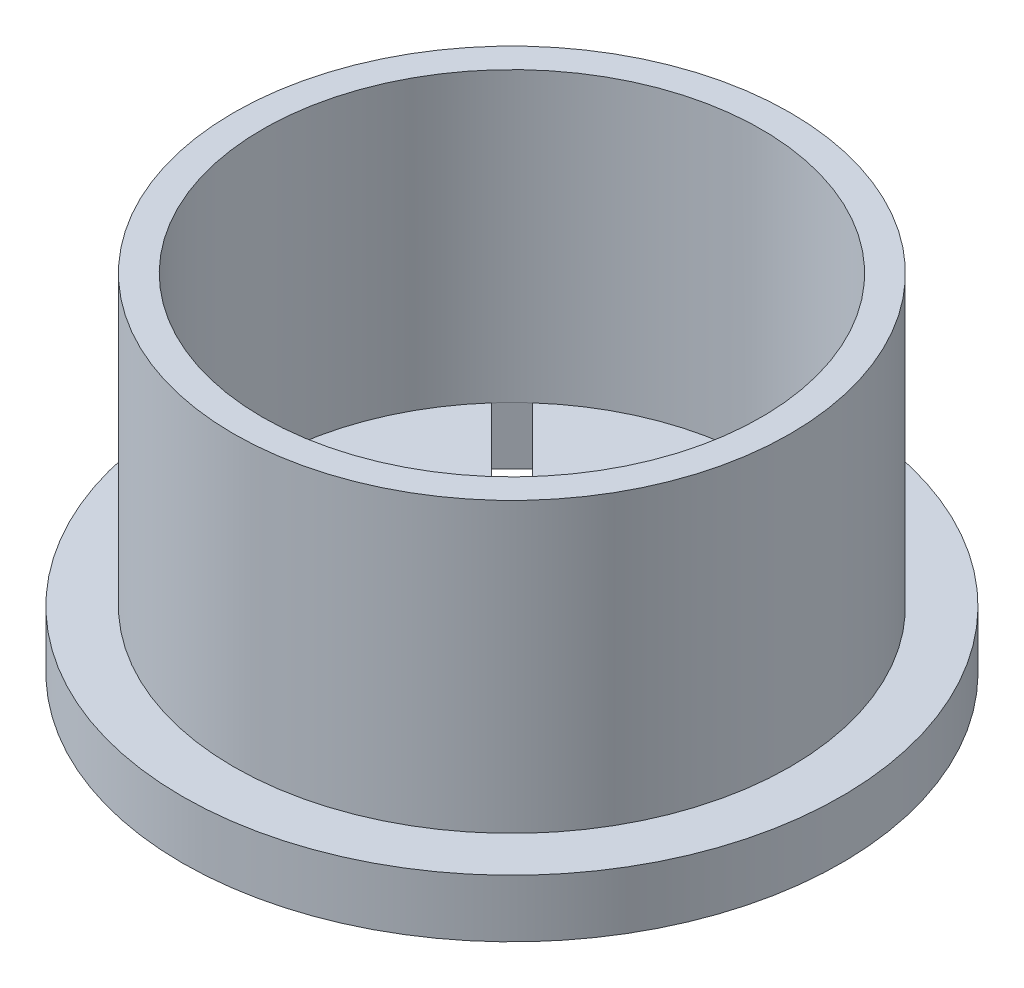
ISO-10303-21;
HEADER;
FILE_DESCRIPTION(('STEP AP214'),'2;1');
FILE_NAME('part.step','',(''),(''),'','','');
FILE_SCHEMA(('AUTOMOTIVE_DESIGN { 1 0 10303 214 1 1 1 1 }'));
ENDSEC;
DATA;
#1=APPLICATION_CONTEXT('core data for automotive mechanical design processes');
#2=APPLICATION_PROTOCOL_DEFINITION('international standard','automotive_design',2000,#1);
#3=PRODUCT_CONTEXT('',#1,'mechanical');
#4=PRODUCT('Part','Part','',(#3));
#5=PRODUCT_RELATED_PRODUCT_CATEGORY('part','',(#4));
#6=PRODUCT_DEFINITION_FORMATION('','',#4);
#7=PRODUCT_DEFINITION_CONTEXT('part definition',#1,'design');
#8=PRODUCT_DEFINITION('design','',#6,#7);
#9=PRODUCT_DEFINITION_SHAPE('','',#8);
#10=(LENGTH_UNIT() NAMED_UNIT(*) SI_UNIT(.MILLI.,.METRE.));
#11=(NAMED_UNIT(*) PLANE_ANGLE_UNIT() SI_UNIT($,.RADIAN.));
#12=(NAMED_UNIT(*) SI_UNIT($,.STERADIAN.) SOLID_ANGLE_UNIT());
#13=UNCERTAINTY_MEASURE_WITH_UNIT(LENGTH_MEASURE(1.E-05),#10,'distance_accuracy_value','');
#14=(GEOMETRIC_REPRESENTATION_CONTEXT(3) GLOBAL_UNCERTAINTY_ASSIGNED_CONTEXT((#13)) GLOBAL_UNIT_ASSIGNED_CONTEXT((#10,
#11,#12)) REPRESENTATION_CONTEXT('',''));
#15=CARTESIAN_POINT('',(0.,0.,0.));
#16=DIRECTION('',(0.,0.,1.));
#17=DIRECTION('',(1.,0.,0.));
#18=AXIS2_PLACEMENT_3D('',#15,#16,#17);
#19=CARTESIAN_POINT('',(0.,2.,0.));
#20=DIRECTION('',(0.,1.,0.));
#21=DIRECTION('',(0.,0.,1.));
#22=AXIS2_PLACEMENT_3D('',#19,#20,#21);
#23=PLANE('',#22);
#24=DIRECTION('',(0.707106781186549,0.,0.707106781186546));
#25=VECTOR('',#24,1.);
#26=CARTESIAN_POINT('',(-6.47002704785691,2.,-5.76292026667039));
#27=LINE('',#26,#25);
#28=CARTESIAN_POINT('',(5.75269341083889,2.,6.45980019202536));
#29=VERTEX_POINT('',#28);
#30=CARTESIAN_POINT('',(5.76292026667038,2.,6.47002704785686));
#31=VERTEX_POINT('',#30);
#32=EDGE_CURVE('E714',#29,#31,#27,.T.);
#33=ORIENTED_EDGE('',*,*,#32,.F.);
#34=CARTESIAN_POINT('',(0.,2.,0.));
#35=DIRECTION('',(0.,1.,0.));
#36=DIRECTION('',(0.,0.,1.));
#37=AXIS2_PLACEMENT_3D('',#34,#35,#36);
#38=CIRCLE('',#37,8.65);
#39=CARTESIAN_POINT('',(6.11647365726365,2.,6.11647365726362));
#40=VERTEX_POINT('',#39);
#41=EDGE_CURVE('E427',#29,#40,#38,.T.);
#42=ORIENTED_EDGE('',*,*,#41,.T.);
#43=DIRECTION('',(-0.707106781186546,0.,0.707106781186549));
#44=VECTOR('',#43,1.);
#45=CARTESIAN_POINT('',(6.47002704785693,2.,5.76292026667031));
#46=LINE('',#45,#44);
#47=EDGE_CURVE('E712',#40,#31,#46,.T.);
#48=ORIENTED_EDGE('',*,*,#47,.T.);
#49=EDGE_LOOP('',(#33,#42,#48));
#50=FACE_BOUND('',#49,.T.);
#51=ADVANCED_FACE('F177',(#50),#23,.F.);
#52=CARTESIAN_POINT('',(6.47002704785693,2.,5.76292026667031));
#53=VERTEX_POINT('',#52);
#54=EDGE_CURVE('E719',#53,#40,#46,.T.);
#55=ORIENTED_EDGE('',*,*,#54,.T.);
#56=CARTESIAN_POINT('',(6.45980019202543,2.,5.75269341083881));
#57=VERTEX_POINT('',#56);
#58=EDGE_CURVE('E702',#40,#57,#38,.T.);
#59=ORIENTED_EDGE('',*,*,#58,.T.);
#60=DIRECTION('',(0.707106781186549,0.,0.707106781186546));
#61=VECTOR('',#60,1.);
#62=CARTESIAN_POINT('',(-5.76292026667036,2.,-6.47002704785694));
#63=LINE('',#62,#61);
#64=EDGE_CURVE('E725',#57,#53,#63,.T.);
#65=ORIENTED_EDGE('',*,*,#64,.T.);
#66=EDGE_LOOP('',(#55,#59,#65));
#67=FACE_BOUND('',#66,.T.);
#68=ADVANCED_FACE('F724',(#67),#23,.F.);
#69=DIRECTION('',(1.,0.,0.));
#70=VECTOR('',#69,1.);
#71=CARTESIAN_POINT('',(-8.65,2.,0.5));
#72=LINE('',#71,#70);
#73=CARTESIAN_POINT('',(8.63553704178264,2.,0.5));
#74=VERTEX_POINT('',#73);
#75=CARTESIAN_POINT('',(8.65,2.,0.5));
#76=VERTEX_POINT('',#75);
#77=EDGE_CURVE('E551',#74,#76,#72,.T.);
#78=ORIENTED_EDGE('',*,*,#77,.F.);
#79=CARTESIAN_POINT('',(8.65,2.,0.));
#80=VERTEX_POINT('',#79);
#81=EDGE_CURVE('E693',#74,#80,#38,.T.);
#82=ORIENTED_EDGE('',*,*,#81,.T.);
#83=DIRECTION('',(0.,0.,1.));
#84=VECTOR('',#83,1.);
#85=CARTESIAN_POINT('',(8.65,2.,-0.5));
#86=LINE('',#85,#84);
#87=EDGE_CURVE('E552',#80,#76,#86,.T.);
#88=ORIENTED_EDGE('',*,*,#87,.T.);
#89=EDGE_LOOP('',(#78,#82,#88));
#90=FACE_BOUND('',#89,.T.);
#91=ADVANCED_FACE('F776',(#90),#23,.F.);
#92=CARTESIAN_POINT('',(8.65,2.,-0.5));
#93=VERTEX_POINT('',#92);
#94=EDGE_CURVE('E912',#93,#80,#86,.T.);
#95=ORIENTED_EDGE('',*,*,#94,.T.);
#96=CARTESIAN_POINT('',(8.63553704178264,2.,-0.5));
#97=VERTEX_POINT('',#96);
#98=EDGE_CURVE('E688',#80,#97,#38,.T.);
#99=ORIENTED_EDGE('',*,*,#98,.T.);
#100=DIRECTION('',(1.,0.,0.));
#101=VECTOR('',#100,1.);
#102=CARTESIAN_POINT('',(-8.65,2.,-0.5));
#103=LINE('',#102,#101);
#104=EDGE_CURVE('E914',#97,#93,#103,.T.);
#105=ORIENTED_EDGE('',*,*,#104,.T.);
#106=EDGE_LOOP('',(#95,#99,#105));
#107=FACE_BOUND('',#106,.T.);
#108=ADVANCED_FACE('F918',(#107),#23,.F.);
#109=DIRECTION('',(-0.707106781186544,0.,0.707106781186551));
#110=VECTOR('',#109,1.);
#111=CARTESIAN_POINT('',(6.47002704785697,2.,-5.76292026667044));
#112=LINE('',#111,#110);
#113=CARTESIAN_POINT('',(6.47002704785697,2.,-5.76292026667044));
#114=VERTEX_POINT('',#113);
#115=CARTESIAN_POINT('',(6.45980019202539,2.,-5.75269341083886));
#116=VERTEX_POINT('',#115);
#117=EDGE_CURVE('E586',#114,#116,#112,.T.);
#118=ORIENTED_EDGE('',*,*,#117,.T.);
#119=CARTESIAN_POINT('',(6.1164736572636,2.,-6.11647365726367));
#120=VERTEX_POINT('',#119);
#121=EDGE_CURVE('E679',#116,#120,#38,.T.);
#122=ORIENTED_EDGE('',*,*,#121,.T.);
#123=DIRECTION('',(-0.707106781186551,0.,-0.707106781186544));
#124=VECTOR('',#123,1.);
#125=CARTESIAN_POINT('',(6.47002704785697,2.,-5.76292026667044));
#126=LINE('',#125,#124);
#127=EDGE_CURVE('E602',#114,#120,#126,.T.);
#128=ORIENTED_EDGE('',*,*,#127,.F.);
#129=EDGE_LOOP('',(#118,#122,#128));
#130=FACE_BOUND('',#129,.T.);
#131=ADVANCED_FACE('F769',(#130),#23,.F.);
#132=CARTESIAN_POINT('',(5.76292026667041,2.,-6.47002704785698));
#133=VERTEX_POINT('',#132);
#134=EDGE_CURVE('E515',#120,#133,#126,.T.);
#135=ORIENTED_EDGE('',*,*,#134,.F.);
#136=CARTESIAN_POINT('',(5.75269341083884,2.,-6.4598001920254));
#137=VERTEX_POINT('',#136);
#138=EDGE_CURVE('E674',#120,#137,#38,.T.);
#139=ORIENTED_EDGE('',*,*,#138,.T.);
#140=DIRECTION('',(-0.707106781186544,0.,0.707106781186551));
#141=VECTOR('',#140,1.);
#142=CARTESIAN_POINT('',(5.76292026667041,2.,-6.47002704785698));
#143=LINE('',#142,#141);
#144=EDGE_CURVE('E597',#133,#137,#143,.T.);
#145=ORIENTED_EDGE('',*,*,#144,.F.);
#146=EDGE_LOOP('',(#135,#139,#145));
#147=FACE_BOUND('',#146,.T.);
#148=ADVANCED_FACE('F762',(#147),#23,.F.);
#149=DIRECTION('',(0.,0.,1.));
#150=VECTOR('',#149,1.);
#151=CARTESIAN_POINT('',(0.500000000000019,2.,-8.65000000000006));
#152=LINE('',#151,#150);
#153=CARTESIAN_POINT('',(0.500000000000019,2.,-8.65000000000006));
#154=VERTEX_POINT('',#153);
#155=CARTESIAN_POINT('',(0.500000000000019,2.,-8.63553704178264));
#156=VERTEX_POINT('',#155);
#157=EDGE_CURVE('E423',#154,#156,#152,.T.);
#158=ORIENTED_EDGE('',*,*,#157,.T.);
#159=CARTESIAN_POINT('',(0.,2.,-8.65));
#160=VERTEX_POINT('',#159);
#161=EDGE_CURVE('E669',#156,#160,#38,.T.);
#162=ORIENTED_EDGE('',*,*,#161,.T.);
#163=DIRECTION('',(-1.,0.,0.));
#164=VECTOR('',#163,1.);
#165=CARTESIAN_POINT('',(0.500000000000019,2.,-8.65000000000006));
#166=LINE('',#165,#164);
#167=EDGE_CURVE('E470',#154,#160,#166,.T.);
#168=ORIENTED_EDGE('',*,*,#167,.F.);
#169=EDGE_LOOP('',(#158,#162,#168));
#170=FACE_BOUND('',#169,.T.);
#171=ADVANCED_FACE('F759',(#170),#23,.F.);
#172=CARTESIAN_POINT('',(-0.499999999999981,2.,-8.65000000000005));
#173=VERTEX_POINT('',#172);
#174=EDGE_CURVE('E474',#160,#173,#166,.T.);
#175=ORIENTED_EDGE('',*,*,#174,.F.);
#176=CARTESIAN_POINT('',(-0.499999999999981,2.,-8.63553704178264));
#177=VERTEX_POINT('',#176);
#178=EDGE_CURVE('E664',#160,#177,#38,.T.);
#179=ORIENTED_EDGE('',*,*,#178,.T.);
#180=DIRECTION('',(0.,0.,1.));
#181=VECTOR('',#180,1.);
#182=CARTESIAN_POINT('',(-0.499999999999981,2.,-8.65000000000005));
#183=LINE('',#182,#181);
#184=EDGE_CURVE('E475',#173,#177,#183,.T.);
#185=ORIENTED_EDGE('',*,*,#184,.F.);
#186=EDGE_LOOP('',(#175,#179,#185));
#187=FACE_BOUND('',#186,.T.);
#188=ADVANCED_FACE('F761',(#187),#23,.F.);
#189=CARTESIAN_POINT('',(-5.76292026667036,2.,-6.47002704785694));
#190=VERTEX_POINT('',#189);
#191=CARTESIAN_POINT('',(-5.75269341083883,2.,-6.45980019202541));
#192=VERTEX_POINT('',#191);
#193=EDGE_CURVE('E732',#190,#192,#63,.T.);
#194=ORIENTED_EDGE('',*,*,#193,.T.);
#195=CARTESIAN_POINT('',(-6.11647365726365,2.,-6.11647365726362));
#196=VERTEX_POINT('',#195);
#197=EDGE_CURVE('E653',#192,#196,#38,.T.);
#198=ORIENTED_EDGE('',*,*,#197,.T.);
#199=DIRECTION('',(-0.707106781186546,0.,0.707106781186549));
#200=VECTOR('',#199,1.);
#201=CARTESIAN_POINT('',(-5.76292026667036,2.,-6.47002704785694));
#202=LINE('',#201,#200);
#203=EDGE_CURVE('E750',#190,#196,#202,.T.);
#204=ORIENTED_EDGE('',*,*,#203,.F.);
#205=EDGE_LOOP('',(#194,#198,#204));
#206=FACE_BOUND('',#205,.T.);
#207=ADVANCED_FACE('F768',(#206),#23,.F.);
#208=CARTESIAN_POINT('',(-6.47002704785691,2.,-5.76292026667039));
#209=VERTEX_POINT('',#208);
#210=EDGE_CURVE('E752',#196,#209,#202,.T.);
#211=ORIENTED_EDGE('',*,*,#210,.F.);
#212=CARTESIAN_POINT('',(-6.45980019202538,2.,-5.75269341083886));
#213=VERTEX_POINT('',#212);
#214=EDGE_CURVE('E648',#196,#213,#38,.T.);
#215=ORIENTED_EDGE('',*,*,#214,.T.);
#216=EDGE_CURVE('E722',#209,#213,#27,.T.);
#217=ORIENTED_EDGE('',*,*,#216,.F.);
#218=EDGE_LOOP('',(#211,#215,#217));
#219=FACE_BOUND('',#218,.T.);
#220=ADVANCED_FACE('F891',(#219),#23,.F.);
#221=CARTESIAN_POINT('',(-8.65,2.,-0.5));
#222=VERTEX_POINT('',#221);
#223=CARTESIAN_POINT('',(-8.63553704178264,2.,-0.5));
#224=VERTEX_POINT('',#223);
#225=EDGE_CURVE('E574',#222,#224,#103,.T.);
#226=ORIENTED_EDGE('',*,*,#225,.T.);
#227=CARTESIAN_POINT('',(-8.65,2.,0.));
#228=VERTEX_POINT('',#227);
#229=EDGE_CURVE('E640',#224,#228,#38,.T.);
#230=ORIENTED_EDGE('',*,*,#229,.T.);
#231=DIRECTION('',(0.,0.,1.));
#232=VECTOR('',#231,1.);
#233=CARTESIAN_POINT('',(-8.65,2.,-0.5));
#234=LINE('',#233,#232);
#235=EDGE_CURVE('E556',#222,#228,#234,.T.);
#236=ORIENTED_EDGE('',*,*,#235,.F.);
#237=EDGE_LOOP('',(#226,#230,#236));
#238=FACE_BOUND('',#237,.T.);
#239=ADVANCED_FACE('F893',(#238),#23,.F.);
#240=CARTESIAN_POINT('',(-8.65,2.,0.5));
#241=VERTEX_POINT('',#240);
#242=EDGE_CURVE('E506',#228,#241,#234,.T.);
#243=ORIENTED_EDGE('',*,*,#242,.F.);
#244=CARTESIAN_POINT('',(-8.63553704178264,2.,0.5));
#245=VERTEX_POINT('',#244);
#246=EDGE_CURVE('E638',#228,#245,#38,.T.);
#247=ORIENTED_EDGE('',*,*,#246,.T.);
#248=EDGE_CURVE('E545',#241,#245,#72,.T.);
#249=ORIENTED_EDGE('',*,*,#248,.F.);
#250=EDGE_LOOP('',(#243,#247,#249));
#251=FACE_BOUND('',#250,.T.);
#252=ADVANCED_FACE('F898',(#251),#23,.F.);
#253=CARTESIAN_POINT('',(-6.45980019202534,2.,5.75269341083891));
#254=VERTEX_POINT('',#253);
#255=CARTESIAN_POINT('',(-6.47002704785679,2.,5.76292026667036));
#256=VERTEX_POINT('',#255);
#257=EDGE_CURVE('E601',#254,#256,#143,.T.);
#258=ORIENTED_EDGE('',*,*,#257,.F.);
#259=CARTESIAN_POINT('',(-6.1164736572636,2.,6.11647365726367));
#260=VERTEX_POINT('',#259);
#261=EDGE_CURVE('E629',#254,#260,#38,.T.);
#262=ORIENTED_EDGE('',*,*,#261,.T.);
#263=DIRECTION('',(-0.707106781186551,0.,-0.707106781186544));
#264=VECTOR('',#263,1.);
#265=CARTESIAN_POINT('',(-5.76292026667024,2.,6.4700270478569));
#266=LINE('',#265,#264);
#267=EDGE_CURVE('E596',#260,#256,#266,.T.);
#268=ORIENTED_EDGE('',*,*,#267,.T.);
#269=EDGE_LOOP('',(#258,#262,#268));
#270=FACE_BOUND('',#269,.T.);
#271=ADVANCED_FACE('F861',(#270),#23,.F.);
#272=CARTESIAN_POINT('',(-5.76292026667024,2.,6.4700270478569));
#273=VERTEX_POINT('',#272);
#274=EDGE_CURVE('E593',#273,#260,#266,.T.);
#275=ORIENTED_EDGE('',*,*,#274,.T.);
#276=CARTESIAN_POINT('',(-5.75269341083879,2.,6.45980019202545));
#277=VERTEX_POINT('',#276);
#278=EDGE_CURVE('E625',#260,#277,#38,.T.);
#279=ORIENTED_EDGE('',*,*,#278,.T.);
#280=EDGE_CURVE('E591',#277,#273,#112,.T.);
#281=ORIENTED_EDGE('',*,*,#280,.T.);
#282=EDGE_LOOP('',(#275,#279,#281));
#283=FACE_BOUND('',#282,.T.);
#284=ADVANCED_FACE('F793',(#283),#23,.F.);
#285=DIRECTION('',(-1.,0.,0.));
#286=VECTOR('',#285,1.);
#287=CARTESIAN_POINT('',(0.500000000000082,2.,8.64999999999994));
#288=LINE('',#287,#286);
#289=CARTESIAN_POINT('',(0.500000000000082,2.,8.64999999999994));
#290=VERTEX_POINT('',#289);
#291=CARTESIAN_POINT('',(0.,2.,8.64999999999994));
#292=VERTEX_POINT('',#291);
#293=EDGE_CURVE('E434',#290,#292,#288,.T.);
#294=ORIENTED_EDGE('',*,*,#293,.T.);
#295=CARTESIAN_POINT('',(0.500000000000082,2.,8.63553704178263));
#296=VERTEX_POINT('',#295);
#297=EDGE_CURVE('E192',#292,#296,#38,.T.);
#298=ORIENTED_EDGE('',*,*,#297,.T.);
#299=EDGE_CURVE('E421',#296,#290,#152,.T.);
#300=ORIENTED_EDGE('',*,*,#299,.T.);
#301=EDGE_LOOP('',(#294,#298,#300));
#302=FACE_BOUND('',#301,.T.);
#303=ADVANCED_FACE('F431',(#302),#23,.F.);
#304=CARTESIAN_POINT('',(0.,2.,0.));
#305=DIRECTION('',(0.,1.,0.));
#306=DIRECTION('',(0.,0.,1.));
#307=AXIS2_PLACEMENT_3D('',#304,#305,#306);
#308=PLANE('',#307);
#309=CARTESIAN_POINT('',(0.,2.,0.));
#310=DIRECTION('',(0.,1.,0.));
#311=DIRECTION('',(0.,0.,1.));
#312=AXIS2_PLACEMENT_3D('',#309,#310,#311);
#313=CIRCLE('',#312,11.43);
#314=CARTESIAN_POINT('',(0.,2.,11.43));
#315=VERTEX_POINT('',#314);
#316=EDGE_CURVE('E12',#315,#315,#313,.T.);
#317=ORIENTED_EDGE('',*,*,#316,.T.);
#318=EDGE_LOOP('',(#317));
#319=FACE_BOUND('',#318,.T.);
#320=CARTESIAN_POINT('',(0.,2.,0.));
#321=DIRECTION('',(0.,1.,0.));
#322=DIRECTION('',(0.,0.,1.));
#323=AXIS2_PLACEMENT_3D('',#320,#321,#322);
#324=CIRCLE('',#323,9.65);
#325=CARTESIAN_POINT('',(0.,2.,9.65));
#326=VERTEX_POINT('',#325);
#327=EDGE_CURVE('E435',#326,#326,#324,.T.);
#328=ORIENTED_EDGE('',*,*,#327,.F.);
#329=EDGE_LOOP('',(#328));
#330=FACE_BOUND('',#329,.T.);
#331=ADVANCED_FACE('F792',(#319,#330),#308,.T.);
#332=CARTESIAN_POINT('',(0.,2.,0.));
#333=DIRECTION('',(0.,-1.,0.));
#334=DIRECTION('',(0.,0.,-1.));
#335=AXIS2_PLACEMENT_3D('',#332,#333,#334);
#336=CYLINDRICAL_SURFACE('',#335,11.43);
#337=ORIENTED_EDGE('',*,*,#316,.F.);
#338=EDGE_LOOP('',(#337));
#339=FACE_BOUND('',#338,.T.);
#340=CARTESIAN_POINT('',(0.,0.,0.));
#341=DIRECTION('',(0.,1.,0.));
#342=DIRECTION('',(0.,0.,1.));
#343=AXIS2_PLACEMENT_3D('',#340,#341,#342);
#344=CIRCLE('',#343,11.43);
#345=CARTESIAN_POINT('',(0.,0.,11.43));
#346=VERTEX_POINT('',#345);
#347=EDGE_CURVE('E181',#346,#346,#344,.T.);
#348=ORIENTED_EDGE('',*,*,#347,.T.);
#349=EDGE_LOOP('',(#348));
#350=FACE_BOUND('',#349,.T.);
#351=ADVANCED_FACE('F179',(#339,#350),#336,.T.);
#352=CARTESIAN_POINT('',(0.,0.,0.));
#353=DIRECTION('',(0.,1.,0.));
#354=DIRECTION('',(0.,0.,1.));
#355=AXIS2_PLACEMENT_3D('',#352,#353,#354);
#356=PLANE('',#355);
#357=DIRECTION('',(-0.707106781186551,0.,-0.707106781186544));
#358=VECTOR('',#357,1.);
#359=CARTESIAN_POINT('',(6.47002704785697,0.,-5.76292026667044));
#360=LINE('',#359,#358);
#361=CARTESIAN_POINT('',(6.47002704785697,0.,-5.76292026667044));
#362=VERTEX_POINT('',#361);
#363=CARTESIAN_POINT('',(5.76292026667041,0.,-6.47002704785698));
#364=VERTEX_POINT('',#363);
#365=EDGE_CURVE('E589',#362,#364,#360,.T.);
#366=ORIENTED_EDGE('',*,*,#365,.T.);
#367=DIRECTION('',(-0.707106781186544,0.,0.707106781186551));
#368=VECTOR('',#367,1.);
#369=CARTESIAN_POINT('',(5.76292026667041,0.,-6.47002704785698));
#370=LINE('',#369,#368);
#371=CARTESIAN_POINT('',(0.500000000000046,0.,-1.20710678118656));
#372=VERTEX_POINT('',#371);
#373=EDGE_CURVE('E610',#364,#372,#370,.T.);
#374=ORIENTED_EDGE('',*,*,#373,.T.);
#375=DIRECTION('',(0.,0.,1.));
#376=VECTOR('',#375,1.);
#377=CARTESIAN_POINT('',(0.500000000000019,0.,-8.65000000000006));
#378=LINE('',#377,#376);
#379=CARTESIAN_POINT('',(0.500000000000019,0.,-8.65000000000006));
#380=VERTEX_POINT('',#379);
#381=EDGE_CURVE('E466',#380,#372,#378,.T.);
#382=ORIENTED_EDGE('',*,*,#381,.F.);
#383=DIRECTION('',(-1.,0.,0.));
#384=VECTOR('',#383,1.);
#385=CARTESIAN_POINT('',(0.500000000000019,0.,-8.65000000000006));
#386=LINE('',#385,#384);
#387=CARTESIAN_POINT('',(-0.499999999999981,0.,-8.65000000000005));
#388=VERTEX_POINT('',#387);
#389=EDGE_CURVE('E444',#380,#388,#386,.T.);
#390=ORIENTED_EDGE('',*,*,#389,.T.);
#391=DIRECTION('',(0.,0.,1.));
#392=VECTOR('',#391,1.);
#393=CARTESIAN_POINT('',(-0.499999999999981,0.,-8.65000000000005));
#394=LINE('',#393,#392);
#395=CARTESIAN_POINT('',(-0.499999999999953,0.,-1.20710678118655));
#396=VERTEX_POINT('',#395);
#397=EDGE_CURVE('E457',#388,#396,#394,.T.);
#398=ORIENTED_EDGE('',*,*,#397,.T.);
#399=DIRECTION('',(0.707106781186549,0.,0.707106781186546));
#400=VECTOR('',#399,1.);
#401=CARTESIAN_POINT('',(-5.76292026667036,0.,-6.47002704785694));
#402=LINE('',#401,#400);
#403=CARTESIAN_POINT('',(-5.76292026667036,0.,-6.47002704785694));
#404=VERTEX_POINT('',#403);
#405=EDGE_CURVE('E738',#404,#396,#402,.T.);
#406=ORIENTED_EDGE('',*,*,#405,.F.);
#407=DIRECTION('',(-0.707106781186546,0.,0.707106781186549));
#408=VECTOR('',#407,1.);
#409=CARTESIAN_POINT('',(-5.76292026667036,0.,-6.47002704785694));
#410=LINE('',#409,#408);
#411=CARTESIAN_POINT('',(-6.47002704785691,0.,-5.76292026667039));
#412=VERTEX_POINT('',#411);
#413=EDGE_CURVE('E734',#404,#412,#410,.T.);
#414=ORIENTED_EDGE('',*,*,#413,.T.);
#415=DIRECTION('',(0.707106781186549,0.,0.707106781186546));
#416=VECTOR('',#415,1.);
#417=CARTESIAN_POINT('',(-6.47002704785691,0.,-5.76292026667039));
#418=LINE('',#417,#416);
#419=CARTESIAN_POINT('',(-1.2071067811865,0.,-0.5));
#420=VERTEX_POINT('',#419);
#421=EDGE_CURVE('E870',#412,#420,#418,.T.);
#422=ORIENTED_EDGE('',*,*,#421,.T.);
#423=DIRECTION('',(1.,0.,0.));
#424=VECTOR('',#423,1.);
#425=CARTESIAN_POINT('',(-8.65,0.,-0.5));
#426=LINE('',#425,#424);
#427=CARTESIAN_POINT('',(-8.65,0.,-0.5));
#428=VERTEX_POINT('',#427);
#429=EDGE_CURVE('E564',#428,#420,#426,.T.);
#430=ORIENTED_EDGE('',*,*,#429,.F.);
#431=DIRECTION('',(0.,0.,1.));
#432=VECTOR('',#431,1.);
#433=CARTESIAN_POINT('',(-8.65,0.,-0.5));
#434=LINE('',#433,#432);
#435=CARTESIAN_POINT('',(-8.65,0.,0.5));
#436=VERTEX_POINT('',#435);
#437=EDGE_CURVE('E200',#428,#436,#434,.T.);
#438=ORIENTED_EDGE('',*,*,#437,.T.);
#439=DIRECTION('',(1.,0.,0.));
#440=VECTOR('',#439,1.);
#441=CARTESIAN_POINT('',(-8.65,0.,0.5));
#442=LINE('',#441,#440);
#443=CARTESIAN_POINT('',(-1.20710678118649,0.,0.499999999999999));
#444=VERTEX_POINT('',#443);
#445=EDGE_CURVE('E541',#436,#444,#442,.T.);
#446=ORIENTED_EDGE('',*,*,#445,.T.);
#447=CARTESIAN_POINT('',(-6.47002704785679,0.,5.76292026667036));
#448=VERTEX_POINT('',#447);
#449=EDGE_CURVE('E534',#444,#448,#370,.T.);
#450=ORIENTED_EDGE('',*,*,#449,.T.);
#451=DIRECTION('',(-0.707106781186551,0.,-0.707106781186544));
#452=VECTOR('',#451,1.);
#453=CARTESIAN_POINT('',(-5.76292026667024,0.,6.4700270478569));
#454=LINE('',#453,#452);
#455=CARTESIAN_POINT('',(-5.76292026667024,0.,6.4700270478569));
#456=VERTEX_POINT('',#455);
#457=EDGE_CURVE('E608',#456,#448,#454,.T.);
#458=ORIENTED_EDGE('',*,*,#457,.F.);
#459=DIRECTION('',(-0.707106781186544,0.,0.707106781186551));
#460=VECTOR('',#459,1.);
#461=CARTESIAN_POINT('',(6.47002704785697,0.,-5.76292026667044));
#462=LINE('',#461,#460);
#463=CARTESIAN_POINT('',(-0.499999999999945,0.,1.20710678118655));
#464=VERTEX_POINT('',#463);
#465=EDGE_CURVE('E607',#464,#456,#462,.T.);
#466=ORIENTED_EDGE('',*,*,#465,.F.);
#467=CARTESIAN_POINT('',(-0.499999999999918,0.,8.64999999999994));
#468=VERTEX_POINT('',#467);
#469=EDGE_CURVE('E450',#464,#468,#394,.T.);
#470=ORIENTED_EDGE('',*,*,#469,.T.);
#471=DIRECTION('',(-1.,0.,0.));
#472=VECTOR('',#471,1.);
#473=CARTESIAN_POINT('',(0.500000000000082,0.,8.64999999999994));
#474=LINE('',#473,#472);
#475=CARTESIAN_POINT('',(0.500000000000082,0.,8.64999999999994));
#476=VERTEX_POINT('',#475);
#477=EDGE_CURVE('E463',#476,#468,#474,.T.);
#478=ORIENTED_EDGE('',*,*,#477,.F.);
#479=CARTESIAN_POINT('',(0.500000000000055,0.,1.20710678118655));
#480=VERTEX_POINT('',#479);
#481=EDGE_CURVE('E465',#480,#476,#378,.T.);
#482=ORIENTED_EDGE('',*,*,#481,.F.);
#483=CARTESIAN_POINT('',(5.76292026667038,0.,6.47002704785686));
#484=VERTEX_POINT('',#483);
#485=EDGE_CURVE('E883',#480,#484,#418,.T.);
#486=ORIENTED_EDGE('',*,*,#485,.T.);
#487=DIRECTION('',(-0.707106781186546,0.,0.707106781186549));
#488=VECTOR('',#487,1.);
#489=CARTESIAN_POINT('',(6.47002704785693,0.,5.76292026667031));
#490=LINE('',#489,#488);
#491=CARTESIAN_POINT('',(6.47002704785693,0.,5.76292026667031));
#492=VERTEX_POINT('',#491);
#493=EDGE_CURVE('E747',#492,#484,#490,.T.);
#494=ORIENTED_EDGE('',*,*,#493,.F.);
#495=CARTESIAN_POINT('',(1.2071067811866,0.,0.5));
#496=VERTEX_POINT('',#495);
#497=EDGE_CURVE('E742',#496,#492,#402,.T.);
#498=ORIENTED_EDGE('',*,*,#497,.F.);
#499=CARTESIAN_POINT('',(8.65,0.,0.5));
#500=VERTEX_POINT('',#499);
#501=EDGE_CURVE('E572',#496,#500,#442,.T.);
#502=ORIENTED_EDGE('',*,*,#501,.T.);
#503=DIRECTION('',(0.,0.,1.));
#504=VECTOR('',#503,1.);
#505=CARTESIAN_POINT('',(8.65,0.,-0.5));
#506=LINE('',#505,#504);
#507=CARTESIAN_POINT('',(8.65,0.,-0.5));
#508=VERTEX_POINT('',#507);
#509=EDGE_CURVE('E569',#508,#500,#506,.T.);
#510=ORIENTED_EDGE('',*,*,#509,.F.);
#511=CARTESIAN_POINT('',(1.20710678118659,0.,-0.499999999999999));
#512=VERTEX_POINT('',#511);
#513=EDGE_CURVE('E568',#512,#508,#426,.T.);
#514=ORIENTED_EDGE('',*,*,#513,.F.);
#515=EDGE_CURVE('E579',#362,#512,#462,.T.);
#516=ORIENTED_EDGE('',*,*,#515,.F.);
#517=EDGE_LOOP('',(#366,#374,#382,#390,#398,#406,#414,#422,#430,#438,#446,#450,#458,#466,#470,
#478,#482,#486,#494,#498,#502,#510,#514,#516));
#518=FACE_BOUND('',#517,.T.);
#519=ORIENTED_EDGE('',*,*,#347,.F.);
#520=EDGE_LOOP('',(#519));
#521=FACE_BOUND('',#520,.T.);
#522=ADVANCED_FACE('F805',(#518,#521),#356,.F.);
#523=CARTESIAN_POINT('',(6.47002704785697,0.,-5.76292026667044));
#524=DIRECTION('',(-0.707106781186552,0.,-0.707106781186544));
#525=DIRECTION('',(-0.707106781186544,0.,0.707106781186552));
#526=AXIS2_PLACEMENT_3D('',#523,#524,#525);
#527=PLANE('',#526);
#528=ORIENTED_EDGE('',*,*,#465,.T.);
#529=DIRECTION('',(0.,1.,0.));
#530=VECTOR('',#529,1.);
#531=CARTESIAN_POINT('',(-5.76292026667024,0.,6.4700270478569));
#532=LINE('',#531,#530);
#533=EDGE_CURVE('E582',#456,#273,#532,.T.);
#534=ORIENTED_EDGE('',*,*,#533,.T.);
#535=ORIENTED_EDGE('',*,*,#280,.F.);
#536=CARTESIAN_POINT('',(-0.499999999999945,2.,1.20710678118655));
#537=VERTEX_POINT('',#536);
#538=EDGE_CURVE('E592',#537,#277,#112,.T.);
#539=ORIENTED_EDGE('',*,*,#538,.F.);
#540=DIRECTION('',(0.,1.,0.));
#541=VECTOR('',#540,1.);
#542=CARTESIAN_POINT('',(-0.499999999999945,0.,1.20710678118655));
#543=LINE('',#542,#541);
#544=EDGE_CURVE('E516',#464,#537,#543,.T.);
#545=ORIENTED_EDGE('',*,*,#544,.F.);
#546=EDGE_LOOP('',(#528,#534,#535,#539,#545));
#547=FACE_BOUND('',#546,.T.);
#548=ADVANCED_FACE('F790',(#547),#527,.T.);
#549=CARTESIAN_POINT('',(-5.76292026667024,0.,6.4700270478569));
#550=DIRECTION('',(0.707106781186544,0.,-0.707106781186552));
#551=DIRECTION('',(-0.707106781186551,0.,-0.707106781186544));
#552=AXIS2_PLACEMENT_3D('',#549,#550,#551);
#553=PLANE('',#552);
#554=ORIENTED_EDGE('',*,*,#274,.F.);
#555=ORIENTED_EDGE('',*,*,#533,.F.);
#556=ORIENTED_EDGE('',*,*,#457,.T.);
#557=DIRECTION('',(0.,1.,0.));
#558=VECTOR('',#557,1.);
#559=CARTESIAN_POINT('',(-6.47002704785679,0.,5.76292026667036));
#560=LINE('',#559,#558);
#561=EDGE_CURVE('E578',#448,#256,#560,.T.);
#562=ORIENTED_EDGE('',*,*,#561,.T.);
#563=ORIENTED_EDGE('',*,*,#267,.F.);
#564=EDGE_LOOP('',(#554,#555,#556,#562,#563));
#565=FACE_BOUND('',#564,.T.);
#566=ADVANCED_FACE('F846',(#565),#553,.T.);
#567=CARTESIAN_POINT('',(5.76292026667041,0.,-6.47002704785698));
#568=DIRECTION('',(-0.707106781186551,0.,-0.707106781186544));
#569=DIRECTION('',(-0.707106781186544,0.,0.707106781186551));
#570=AXIS2_PLACEMENT_3D('',#567,#568,#569);
#571=PLANE('',#570);
#572=DIRECTION('',(0.,1.,0.));
#573=VECTOR('',#572,1.);
#574=CARTESIAN_POINT('',(-1.20710678118649,0.,0.5));
#575=LINE('',#574,#573);
#576=CARTESIAN_POINT('',(-1.20710678118649,2.,0.499999999999999));
#577=VERTEX_POINT('',#576);
#578=EDGE_CURVE('E519',#444,#577,#575,.T.);
#579=ORIENTED_EDGE('',*,*,#578,.T.);
#580=EDGE_CURVE('E531',#577,#254,#143,.T.);
#581=ORIENTED_EDGE('',*,*,#580,.T.);
#582=ORIENTED_EDGE('',*,*,#257,.T.);
#583=ORIENTED_EDGE('',*,*,#561,.F.);
#584=ORIENTED_EDGE('',*,*,#449,.F.);
#585=EDGE_LOOP('',(#579,#581,#582,#583,#584));
#586=FACE_BOUND('',#585,.T.);
#587=ADVANCED_FACE('F530',(#586),#571,.F.);
#588=CARTESIAN_POINT('',(-5.76292026667036,0.,-6.47002704785694));
#589=DIRECTION('',(-0.707106781186546,0.,0.707106781186549));
#590=DIRECTION('',(0.707106781186549,0.,0.707106781186546));
#591=AXIS2_PLACEMENT_3D('',#588,#589,#590);
#592=PLANE('',#591);
#593=DIRECTION('',(0.,-1.,0.));
#594=VECTOR('',#593,1.);
#595=CARTESIAN_POINT('',(1.2071067811866,0.,0.5));
#596=LINE('',#595,#594);
#597=CARTESIAN_POINT('',(1.2071067811866,2.,0.5));
#598=VERTEX_POINT('',#597);
#599=EDGE_CURVE('E510',#598,#496,#596,.T.);
#600=ORIENTED_EDGE('',*,*,#599,.T.);
#601=ORIENTED_EDGE('',*,*,#497,.T.);
#602=DIRECTION('',(0.,1.,0.));
#603=VECTOR('',#602,1.);
#604=CARTESIAN_POINT('',(6.47002704785693,0.,5.76292026667031));
#605=LINE('',#604,#603);
#606=EDGE_CURVE('E736',#492,#53,#605,.T.);
#607=ORIENTED_EDGE('',*,*,#606,.T.);
#608=ORIENTED_EDGE('',*,*,#64,.F.);
#609=EDGE_CURVE('E727',#598,#57,#63,.T.);
#610=ORIENTED_EDGE('',*,*,#609,.F.);
#611=EDGE_LOOP('',(#600,#601,#607,#608,#610));
#612=FACE_BOUND('',#611,.T.);
#613=ADVANCED_FACE('F821',(#612),#592,.T.);
#614=CARTESIAN_POINT('',(6.47002704785693,0.,5.76292026667031));
#615=DIRECTION('',(-0.707106781186549,0.,-0.707106781186546));
#616=DIRECTION('',(-0.707106781186546,0.,0.707106781186549));
#617=AXIS2_PLACEMENT_3D('',#614,#615,#616);
#618=PLANE('',#617);
#619=ORIENTED_EDGE('',*,*,#54,.F.);
#620=ORIENTED_EDGE('',*,*,#606,.F.);
#621=ORIENTED_EDGE('',*,*,#493,.T.);
#622=DIRECTION('',(0.,1.,0.));
#623=VECTOR('',#622,1.);
#624=CARTESIAN_POINT('',(5.76292026667038,0.,6.47002704785686));
#625=LINE('',#624,#623);
#626=EDGE_CURVE('E721',#484,#31,#625,.T.);
#627=ORIENTED_EDGE('',*,*,#626,.T.);
#628=ORIENTED_EDGE('',*,*,#47,.F.);
#629=EDGE_LOOP('',(#619,#620,#621,#627,#628));
#630=FACE_BOUND('',#629,.T.);
#631=ADVANCED_FACE('F717',(#630),#618,.T.);
#632=CARTESIAN_POINT('',(-6.47002704785691,0.,-5.76292026667039));
#633=DIRECTION('',(-0.707106781186546,0.,0.707106781186549));
#634=DIRECTION('',(0.707106781186549,0.,0.707106781186546));
#635=AXIS2_PLACEMENT_3D('',#632,#633,#634);
#636=PLANE('',#635);
#637=CARTESIAN_POINT('',(0.500000000000055,2.,1.20710678118655));
#638=VERTEX_POINT('',#637);
#639=EDGE_CURVE('E416',#638,#29,#27,.T.);
#640=ORIENTED_EDGE('',*,*,#639,.T.);
#641=ORIENTED_EDGE('',*,*,#32,.T.);
#642=ORIENTED_EDGE('',*,*,#626,.F.);
#643=ORIENTED_EDGE('',*,*,#485,.F.);
#644=DIRECTION('',(0.,-1.,0.));
#645=VECTOR('',#644,1.);
#646=CARTESIAN_POINT('',(0.500000000000055,0.,1.20710678118655));
#647=LINE('',#646,#645);
#648=EDGE_CURVE('E507',#638,#480,#647,.T.);
#649=ORIENTED_EDGE('',*,*,#648,.F.);
#650=EDGE_LOOP('',(#640,#641,#642,#643,#649));
#651=FACE_BOUND('',#650,.T.);
#652=ADVANCED_FACE('F824',(#651),#636,.F.);
#653=CARTESIAN_POINT('',(0.500000000000019,0.,-8.65000000000006));
#654=DIRECTION('',(-1.,0.,0.));
#655=DIRECTION('',(0.,0.,1.));
#656=AXIS2_PLACEMENT_3D('',#653,#654,#655);
#657=PLANE('',#656);
#658=ORIENTED_EDGE('',*,*,#648,.T.);
#659=ORIENTED_EDGE('',*,*,#481,.T.);
#660=DIRECTION('',(0.,1.,0.));
#661=VECTOR('',#660,1.);
#662=CARTESIAN_POINT('',(0.500000000000082,0.,8.64999999999994));
#663=LINE('',#662,#661);
#664=EDGE_CURVE('E439',#476,#290,#663,.T.);
#665=ORIENTED_EDGE('',*,*,#664,.T.);
#666=ORIENTED_EDGE('',*,*,#299,.F.);
#667=EDGE_CURVE('E411',#638,#296,#152,.T.);
#668=ORIENTED_EDGE('',*,*,#667,.F.);
#669=EDGE_LOOP('',(#658,#659,#665,#666,#668));
#670=FACE_BOUND('',#669,.T.);
#671=ADVANCED_FACE('F437',(#670),#657,.T.);
#672=CARTESIAN_POINT('',(0.500000000000082,0.,8.64999999999994));
#673=DIRECTION('',(0.,0.,-1.));
#674=DIRECTION('',(-1.,0.,0.));
#675=AXIS2_PLACEMENT_3D('',#672,#673,#674);
#676=PLANE('',#675);
#677=ORIENTED_EDGE('',*,*,#293,.F.);
#678=ORIENTED_EDGE('',*,*,#664,.F.);
#679=ORIENTED_EDGE('',*,*,#477,.T.);
#680=DIRECTION('',(0.,1.,0.));
#681=VECTOR('',#680,1.);
#682=CARTESIAN_POINT('',(-0.499999999999918,0.,8.64999999999994));
#683=LINE('',#682,#681);
#684=CARTESIAN_POINT('',(-0.499999999999918,2.,8.64999999999994));
#685=VERTEX_POINT('',#684);
#686=EDGE_CURVE('E492',#468,#685,#683,.T.);
#687=ORIENTED_EDGE('',*,*,#686,.T.);
#688=EDGE_CURVE('E440',#292,#685,#288,.T.);
#689=ORIENTED_EDGE('',*,*,#688,.F.);
#690=EDGE_LOOP('',(#677,#678,#679,#687,#689));
#691=FACE_BOUND('',#690,.T.);
#692=ADVANCED_FACE('F497',(#691),#676,.T.);
#693=CARTESIAN_POINT('',(-0.499999999999981,0.,-8.65000000000005));
#694=DIRECTION('',(-1.,0.,0.));
#695=DIRECTION('',(0.,0.,1.));
#696=AXIS2_PLACEMENT_3D('',#693,#694,#695);
#697=PLANE('',#696);
#698=ORIENTED_EDGE('',*,*,#544,.T.);
#699=CARTESIAN_POINT('',(-0.499999999999918,2.,8.63553704178264));
#700=VERTEX_POINT('',#699);
#701=EDGE_CURVE('E478',#537,#700,#183,.T.);
#702=ORIENTED_EDGE('',*,*,#701,.T.);
#703=EDGE_CURVE('E473',#700,#685,#183,.T.);
#704=ORIENTED_EDGE('',*,*,#703,.T.);
#705=ORIENTED_EDGE('',*,*,#686,.F.);
#706=ORIENTED_EDGE('',*,*,#469,.F.);
#707=EDGE_LOOP('',(#698,#702,#704,#705,#706));
#708=FACE_BOUND('',#707,.T.);
#709=ADVANCED_FACE('F489',(#708),#697,.F.);
#710=CARTESIAN_POINT('',(8.65,0.,-0.5));
#711=DIRECTION('',(-1.,0.,0.));
#712=DIRECTION('',(0.,0.,1.));
#713=AXIS2_PLACEMENT_3D('',#710,#711,#712);
#714=PLANE('',#713);
#715=ORIENTED_EDGE('',*,*,#94,.F.);
#716=DIRECTION('',(0.,1.,0.));
#717=VECTOR('',#716,1.);
#718=CARTESIAN_POINT('',(8.65,0.,-0.5));
#719=LINE('',#718,#717);
#720=EDGE_CURVE('E873',#508,#93,#719,.T.);
#721=ORIENTED_EDGE('',*,*,#720,.F.);
#722=ORIENTED_EDGE('',*,*,#509,.T.);
#723=DIRECTION('',(0.,1.,0.));
#724=VECTOR('',#723,1.);
#725=CARTESIAN_POINT('',(8.65,0.,0.5));
#726=LINE('',#725,#724);
#727=EDGE_CURVE('E876',#500,#76,#726,.T.);
#728=ORIENTED_EDGE('',*,*,#727,.T.);
#729=ORIENTED_EDGE('',*,*,#87,.F.);
#730=EDGE_LOOP('',(#715,#721,#722,#728,#729));
#731=FACE_BOUND('',#730,.T.);
#732=ADVANCED_FACE('F806',(#731),#714,.T.);
#733=CARTESIAN_POINT('',(-8.65,0.,0.5));
#734=DIRECTION('',(0.,0.,1.));
#735=DIRECTION('',(1.,0.,0.));
#736=AXIS2_PLACEMENT_3D('',#733,#734,#735);
#737=PLANE('',#736);
#738=EDGE_CURVE('E549',#598,#74,#72,.T.);
#739=ORIENTED_EDGE('',*,*,#738,.T.);
#740=ORIENTED_EDGE('',*,*,#77,.T.);
#741=ORIENTED_EDGE('',*,*,#727,.F.);
#742=ORIENTED_EDGE('',*,*,#501,.F.);
#743=ORIENTED_EDGE('',*,*,#599,.F.);
#744=EDGE_LOOP('',(#739,#740,#741,#742,#743));
#745=FACE_BOUND('',#744,.T.);
#746=ADVANCED_FACE('F796',(#745),#737,.F.);
#747=CARTESIAN_POINT('',(-8.65,0.,-0.5));
#748=DIRECTION('',(0.,0.,1.));
#749=DIRECTION('',(1.,0.,0.));
#750=AXIS2_PLACEMENT_3D('',#747,#748,#749);
#751=PLANE('',#750);
#752=ORIENTED_EDGE('',*,*,#513,.T.);
#753=ORIENTED_EDGE('',*,*,#720,.T.);
#754=ORIENTED_EDGE('',*,*,#104,.F.);
#755=CARTESIAN_POINT('',(1.20710678118659,2.,-0.499999999999999));
#756=VERTEX_POINT('',#755);
#757=EDGE_CURVE('E915',#756,#97,#103,.T.);
#758=ORIENTED_EDGE('',*,*,#757,.F.);
#759=DIRECTION('',(0.,1.,0.));
#760=VECTOR('',#759,1.);
#761=CARTESIAN_POINT('',(1.20710678118659,0.,-0.5));
#762=LINE('',#761,#760);
#763=EDGE_CURVE('E518',#512,#756,#762,.T.);
#764=ORIENTED_EDGE('',*,*,#763,.F.);
#765=EDGE_LOOP('',(#752,#753,#754,#758,#764));
#766=FACE_BOUND('',#765,.T.);
#767=ADVANCED_FACE('F780',(#766),#751,.T.);
#768=ORIENTED_EDGE('',*,*,#373,.F.);
#769=DIRECTION('',(0.,1.,0.));
#770=VECTOR('',#769,1.);
#771=CARTESIAN_POINT('',(5.76292026667041,0.,-6.47002704785698));
#772=LINE('',#771,#770);
#773=EDGE_CURVE('E575',#364,#133,#772,.T.);
#774=ORIENTED_EDGE('',*,*,#773,.T.);
#775=ORIENTED_EDGE('',*,*,#144,.T.);
#776=CARTESIAN_POINT('',(0.500000000000046,2.,-1.20710678118656));
#777=VERTEX_POINT('',#776);
#778=EDGE_CURVE('E600',#137,#777,#143,.T.);
#779=ORIENTED_EDGE('',*,*,#778,.T.);
#780=DIRECTION('',(0.,1.,0.));
#781=VECTOR('',#780,1.);
#782=CARTESIAN_POINT('',(0.500000000000046,0.,-1.20710678118655));
#783=LINE('',#782,#781);
#784=EDGE_CURVE('E520',#372,#777,#783,.T.);
#785=ORIENTED_EDGE('',*,*,#784,.F.);
#786=EDGE_LOOP('',(#768,#774,#775,#779,#785));
#787=FACE_BOUND('',#786,.T.);
#788=ADVANCED_FACE('F795',(#787),#571,.F.);
#789=CARTESIAN_POINT('',(6.47002704785697,0.,-5.76292026667044));
#790=DIRECTION('',(0.707106781186544,0.,-0.707106781186552));
#791=DIRECTION('',(-0.707106781186552,0.,-0.707106781186544));
#792=AXIS2_PLACEMENT_3D('',#789,#790,#791);
#793=PLANE('',#792);
#794=ORIENTED_EDGE('',*,*,#127,.T.);
#795=ORIENTED_EDGE('',*,*,#134,.T.);
#796=ORIENTED_EDGE('',*,*,#773,.F.);
#797=ORIENTED_EDGE('',*,*,#365,.F.);
#798=DIRECTION('',(0.,1.,0.));
#799=VECTOR('',#798,1.);
#800=CARTESIAN_POINT('',(6.47002704785697,0.,-5.76292026667044));
#801=LINE('',#800,#799);
#802=EDGE_CURVE('E523',#362,#114,#801,.T.);
#803=ORIENTED_EDGE('',*,*,#802,.T.);
#804=EDGE_LOOP('',(#794,#795,#796,#797,#803));
#805=FACE_BOUND('',#804,.T.);
#806=ADVANCED_FACE('F802',(#805),#793,.F.);
#807=ORIENTED_EDGE('',*,*,#763,.T.);
#808=EDGE_CURVE('E590',#116,#756,#112,.T.);
#809=ORIENTED_EDGE('',*,*,#808,.F.);
#810=ORIENTED_EDGE('',*,*,#117,.F.);
#811=ORIENTED_EDGE('',*,*,#802,.F.);
#812=ORIENTED_EDGE('',*,*,#515,.T.);
#813=EDGE_LOOP('',(#807,#809,#810,#811,#812));
#814=FACE_BOUND('',#813,.T.);
#815=ADVANCED_FACE('F830',(#814),#527,.T.);
#816=CARTESIAN_POINT('',(-5.76292026667036,0.,-6.47002704785694));
#817=DIRECTION('',(-0.707106781186549,0.,-0.707106781186546));
#818=DIRECTION('',(-0.707106781186546,0.,0.707106781186549));
#819=AXIS2_PLACEMENT_3D('',#816,#817,#818);
#820=PLANE('',#819);
#821=ORIENTED_EDGE('',*,*,#203,.T.);
#822=ORIENTED_EDGE('',*,*,#210,.T.);
#823=DIRECTION('',(0.,1.,0.));
#824=VECTOR('',#823,1.);
#825=CARTESIAN_POINT('',(-6.47002704785691,0.,-5.76292026667039));
#826=LINE('',#825,#824);
#827=EDGE_CURVE('E460',#412,#209,#826,.T.);
#828=ORIENTED_EDGE('',*,*,#827,.F.);
#829=ORIENTED_EDGE('',*,*,#413,.F.);
#830=DIRECTION('',(0.,1.,0.));
#831=VECTOR('',#830,1.);
#832=CARTESIAN_POINT('',(-5.76292026667036,0.,-6.47002704785694));
#833=LINE('',#832,#831);
#834=EDGE_CURVE('E509',#404,#190,#833,.T.);
#835=ORIENTED_EDGE('',*,*,#834,.T.);
#836=EDGE_LOOP('',(#821,#822,#828,#829,#835));
#837=FACE_BOUND('',#836,.T.);
#838=ADVANCED_FACE('F827',(#837),#820,.F.);
#839=DIRECTION('',(0.,-1.,0.));
#840=VECTOR('',#839,1.);
#841=CARTESIAN_POINT('',(-1.2071067811865,0.,-0.5));
#842=LINE('',#841,#840);
#843=CARTESIAN_POINT('',(-1.2071067811865,2.,-0.5));
#844=VERTEX_POINT('',#843);
#845=EDGE_CURVE('E512',#844,#420,#842,.T.);
#846=ORIENTED_EDGE('',*,*,#845,.T.);
#847=ORIENTED_EDGE('',*,*,#421,.F.);
#848=ORIENTED_EDGE('',*,*,#827,.T.);
#849=ORIENTED_EDGE('',*,*,#216,.T.);
#850=EDGE_CURVE('E754',#213,#844,#27,.T.);
#851=ORIENTED_EDGE('',*,*,#850,.T.);
#852=EDGE_LOOP('',(#846,#847,#848,#849,#851));
#853=FACE_BOUND('',#852,.T.);
#854=ADVANCED_FACE('F820',(#853),#636,.F.);
#855=ORIENTED_EDGE('',*,*,#193,.F.);
#856=ORIENTED_EDGE('',*,*,#834,.F.);
#857=ORIENTED_EDGE('',*,*,#405,.T.);
#858=DIRECTION('',(0.,-1.,0.));
#859=VECTOR('',#858,1.);
#860=CARTESIAN_POINT('',(-0.499999999999954,0.,-1.20710678118655));
#861=LINE('',#860,#859);
#862=CARTESIAN_POINT('',(-0.499999999999953,2.,-1.20710678118655));
#863=VERTEX_POINT('',#862);
#864=EDGE_CURVE('E504',#863,#396,#861,.T.);
#865=ORIENTED_EDGE('',*,*,#864,.F.);
#866=EDGE_CURVE('E729',#192,#863,#63,.T.);
#867=ORIENTED_EDGE('',*,*,#866,.F.);
#868=EDGE_LOOP('',(#855,#856,#857,#865,#867));
#869=FACE_BOUND('',#868,.T.);
#870=ADVANCED_FACE('F816',(#869),#592,.T.);
#871=ORIENTED_EDGE('',*,*,#864,.T.);
#872=ORIENTED_EDGE('',*,*,#397,.F.);
#873=DIRECTION('',(0.,1.,0.));
#874=VECTOR('',#873,1.);
#875=CARTESIAN_POINT('',(-0.499999999999981,0.,-8.65000000000005));
#876=LINE('',#875,#874);
#877=EDGE_CURVE('E469',#388,#173,#876,.T.);
#878=ORIENTED_EDGE('',*,*,#877,.T.);
#879=ORIENTED_EDGE('',*,*,#184,.T.);
#880=EDGE_CURVE('E477',#177,#863,#183,.T.);
#881=ORIENTED_EDGE('',*,*,#880,.T.);
#882=EDGE_LOOP('',(#871,#872,#878,#879,#881));
#883=FACE_BOUND('',#882,.T.);
#884=ADVANCED_FACE('F819',(#883),#697,.F.);
#885=CARTESIAN_POINT('',(0.500000000000019,0.,-8.65000000000006));
#886=DIRECTION('',(0.,0.,-1.));
#887=DIRECTION('',(-1.,0.,0.));
#888=AXIS2_PLACEMENT_3D('',#885,#886,#887);
#889=PLANE('',#888);
#890=ORIENTED_EDGE('',*,*,#167,.T.);
#891=ORIENTED_EDGE('',*,*,#174,.T.);
#892=ORIENTED_EDGE('',*,*,#877,.F.);
#893=ORIENTED_EDGE('',*,*,#389,.F.);
#894=DIRECTION('',(0.,1.,0.));
#895=VECTOR('',#894,1.);
#896=CARTESIAN_POINT('',(0.500000000000019,0.,-8.65000000000006));
#897=LINE('',#896,#895);
#898=EDGE_CURVE('E500',#380,#154,#897,.T.);
#899=ORIENTED_EDGE('',*,*,#898,.T.);
#900=EDGE_LOOP('',(#890,#891,#892,#893,#899));
#901=FACE_BOUND('',#900,.T.);
#902=ADVANCED_FACE('F756',(#901),#889,.F.);
#903=ORIENTED_EDGE('',*,*,#784,.T.);
#904=EDGE_CURVE('E420',#156,#777,#152,.T.);
#905=ORIENTED_EDGE('',*,*,#904,.F.);
#906=ORIENTED_EDGE('',*,*,#157,.F.);
#907=ORIENTED_EDGE('',*,*,#898,.F.);
#908=ORIENTED_EDGE('',*,*,#381,.T.);
#909=EDGE_LOOP('',(#903,#905,#906,#907,#908));
#910=FACE_BOUND('',#909,.T.);
#911=ADVANCED_FACE('F758',(#910),#657,.T.);
#912=ORIENTED_EDGE('',*,*,#445,.F.);
#913=DIRECTION('',(0.,1.,0.));
#914=VECTOR('',#913,1.);
#915=CARTESIAN_POINT('',(-8.65,0.,0.5));
#916=LINE('',#915,#914);
#917=EDGE_CURVE('E567',#436,#241,#916,.T.);
#918=ORIENTED_EDGE('',*,*,#917,.T.);
#919=ORIENTED_EDGE('',*,*,#248,.T.);
#920=EDGE_CURVE('E543',#245,#577,#72,.T.);
#921=ORIENTED_EDGE('',*,*,#920,.T.);
#922=ORIENTED_EDGE('',*,*,#578,.F.);
#923=EDGE_LOOP('',(#912,#918,#919,#921,#922));
#924=FACE_BOUND('',#923,.T.);
#925=ADVANCED_FACE('F539',(#924),#737,.F.);
#926=CARTESIAN_POINT('',(-8.65,0.,-0.5));
#927=DIRECTION('',(-1.,0.,0.));
#928=DIRECTION('',(0.,0.,1.));
#929=AXIS2_PLACEMENT_3D('',#926,#927,#928);
#930=PLANE('',#929);
#931=ORIENTED_EDGE('',*,*,#235,.T.);
#932=ORIENTED_EDGE('',*,*,#242,.T.);
#933=ORIENTED_EDGE('',*,*,#917,.F.);
#934=ORIENTED_EDGE('',*,*,#437,.F.);
#935=DIRECTION('',(0.,1.,0.));
#936=VECTOR('',#935,1.);
#937=CARTESIAN_POINT('',(-8.65,0.,-0.5));
#938=LINE('',#937,#936);
#939=EDGE_CURVE('E513',#428,#222,#938,.T.);
#940=ORIENTED_EDGE('',*,*,#939,.T.);
#941=EDGE_LOOP('',(#931,#932,#933,#934,#940));
#942=FACE_BOUND('',#941,.T.);
#943=ADVANCED_FACE('F787',(#942),#930,.F.);
#944=ORIENTED_EDGE('',*,*,#225,.F.);
#945=ORIENTED_EDGE('',*,*,#939,.F.);
#946=ORIENTED_EDGE('',*,*,#429,.T.);
#947=ORIENTED_EDGE('',*,*,#845,.F.);
#948=EDGE_CURVE('E925',#224,#844,#103,.T.);
#949=ORIENTED_EDGE('',*,*,#948,.F.);
#950=EDGE_LOOP('',(#944,#945,#946,#947,#949));
#951=FACE_BOUND('',#950,.T.);
#952=ADVANCED_FACE('F779',(#951),#751,.T.);
#953=ORIENTED_EDGE('',*,*,#703,.F.);
#954=EDGE_CURVE('E436',#700,#292,#38,.T.);
#955=ORIENTED_EDGE('',*,*,#954,.T.);
#956=ORIENTED_EDGE('',*,*,#688,.T.);
#957=EDGE_LOOP('',(#953,#955,#956));
#958=FACE_BOUND('',#957,.T.);
#959=ADVANCED_FACE('F495',(#958),#23,.F.);
#960=CARTESIAN_POINT('',(0.,12.,0.));
#961=DIRECTION('',(0.,-1.,0.));
#962=DIRECTION('',(0.,0.,-1.));
#963=AXIS2_PLACEMENT_3D('',#960,#961,#962);
#964=CYLINDRICAL_SURFACE('',#963,9.65);
#965=CARTESIAN_POINT('',(0.,12.,0.));
#966=DIRECTION('',(0.,1.,0.));
#967=DIRECTION('',(0.,0.,1.));
#968=AXIS2_PLACEMENT_3D('',#965,#966,#967);
#969=CIRCLE('',#968,9.65);
#970=CARTESIAN_POINT('',(0.,12.,9.65));
#971=VERTEX_POINT('',#970);
#972=EDGE_CURVE('E617',#971,#971,#969,.T.);
#973=ORIENTED_EDGE('',*,*,#972,.F.);
#974=EDGE_LOOP('',(#973));
#975=FACE_BOUND('',#974,.T.);
#976=ORIENTED_EDGE('',*,*,#327,.T.);
#977=EDGE_LOOP('',(#976));
#978=FACE_BOUND('',#977,.T.);
#979=ADVANCED_FACE('F778',(#975,#978),#964,.T.);
#980=CARTESIAN_POINT('',(0.,12.,0.));
#981=DIRECTION('',(0.,1.,0.));
#982=DIRECTION('',(0.,0.,1.));
#983=AXIS2_PLACEMENT_3D('',#980,#981,#982);
#984=PLANE('',#983);
#985=CARTESIAN_POINT('',(0.,12.,0.));
#986=DIRECTION('',(0.,1.,0.));
#987=DIRECTION('',(0.,0.,1.));
#988=AXIS2_PLACEMENT_3D('',#985,#986,#987);
#989=CIRCLE('',#988,8.65);
#990=CARTESIAN_POINT('',(0.,12.,8.65));
#991=VERTEX_POINT('',#990);
#992=EDGE_CURVE('E620',#991,#991,#989,.T.);
#993=ORIENTED_EDGE('',*,*,#992,.F.);
#994=EDGE_LOOP('',(#993));
#995=FACE_BOUND('',#994,.T.);
#996=ORIENTED_EDGE('',*,*,#972,.T.);
#997=EDGE_LOOP('',(#996));
#998=FACE_BOUND('',#997,.T.);
#999=ADVANCED_FACE('F785',(#995,#998),#984,.T.);
#1000=CARTESIAN_POINT('',(0.,2.,0.));
#1001=DIRECTION('',(0.,1.,0.));
#1002=DIRECTION('',(0.,0.,1.));
#1003=AXIS2_PLACEMENT_3D('',#1000,#1001,#1002);
#1004=PLANE('',#1003);
#1005=ORIENTED_EDGE('',*,*,#904,.T.);
#1006=ORIENTED_EDGE('',*,*,#778,.F.);
#1007=EDGE_CURVE('E672',#137,#156,#38,.T.);
#1008=ORIENTED_EDGE('',*,*,#1007,.T.);
#1009=EDGE_LOOP('',(#1005,#1006,#1008));
#1010=FACE_BOUND('',#1009,.T.);
#1011=ADVANCED_FACE('F938',(#1010),#1004,.T.);
#1012=ORIENTED_EDGE('',*,*,#808,.T.);
#1013=ORIENTED_EDGE('',*,*,#757,.T.);
#1014=EDGE_CURVE('E684',#97,#116,#38,.T.);
#1015=ORIENTED_EDGE('',*,*,#1014,.T.);
#1016=EDGE_LOOP('',(#1012,#1013,#1015));
#1017=FACE_BOUND('',#1016,.T.);
#1018=ADVANCED_FACE('F945',(#1017),#1004,.T.);
#1019=ORIENTED_EDGE('',*,*,#609,.T.);
#1020=EDGE_CURVE('E698',#57,#74,#38,.T.);
#1021=ORIENTED_EDGE('',*,*,#1020,.T.);
#1022=ORIENTED_EDGE('',*,*,#738,.F.);
#1023=EDGE_LOOP('',(#1019,#1021,#1022));
#1024=FACE_BOUND('',#1023,.T.);
#1025=ADVANCED_FACE('F904',(#1024),#1004,.T.);
#1026=ORIENTED_EDGE('',*,*,#667,.T.);
#1027=EDGE_CURVE('E413',#296,#29,#38,.T.);
#1028=ORIENTED_EDGE('',*,*,#1027,.T.);
#1029=ORIENTED_EDGE('',*,*,#639,.F.);
#1030=EDGE_LOOP('',(#1026,#1028,#1029));
#1031=FACE_BOUND('',#1030,.T.);
#1032=ADVANCED_FACE('F412',(#1031),#1004,.T.);
#1033=ORIENTED_EDGE('',*,*,#538,.T.);
#1034=EDGE_CURVE('E623',#277,#700,#38,.T.);
#1035=ORIENTED_EDGE('',*,*,#1034,.T.);
#1036=ORIENTED_EDGE('',*,*,#701,.F.);
#1037=EDGE_LOOP('',(#1033,#1035,#1036));
#1038=FACE_BOUND('',#1037,.T.);
#1039=ADVANCED_FACE('F929',(#1038),#1004,.T.);
#1040=ORIENTED_EDGE('',*,*,#948,.T.);
#1041=ORIENTED_EDGE('',*,*,#850,.F.);
#1042=EDGE_CURVE('E644',#213,#224,#38,.T.);
#1043=ORIENTED_EDGE('',*,*,#1042,.T.);
#1044=EDGE_LOOP('',(#1040,#1041,#1043));
#1045=FACE_BOUND('',#1044,.T.);
#1046=ADVANCED_FACE('F926',(#1045),#1004,.T.);
#1047=ORIENTED_EDGE('',*,*,#866,.T.);
#1048=ORIENTED_EDGE('',*,*,#880,.F.);
#1049=EDGE_CURVE('E659',#177,#192,#38,.T.);
#1050=ORIENTED_EDGE('',*,*,#1049,.T.);
#1051=EDGE_LOOP('',(#1047,#1048,#1050));
#1052=FACE_BOUND('',#1051,.T.);
#1053=ADVANCED_FACE('F928',(#1052),#1004,.T.);
#1054=CARTESIAN_POINT('',(0.,2.,0.));
#1055=DIRECTION('',(0.,1.,0.));
#1056=DIRECTION('',(0.,0.,1.));
#1057=AXIS2_PLACEMENT_3D('',#1054,#1055,#1056);
#1058=CYLINDRICAL_SURFACE('',#1057,8.65);
#1059=ORIENTED_EDGE('',*,*,#297,.F.);
#1060=ORIENTED_EDGE('',*,*,#954,.F.);
#1061=ORIENTED_EDGE('',*,*,#1034,.F.);
#1062=ORIENTED_EDGE('',*,*,#278,.F.);
#1063=ORIENTED_EDGE('',*,*,#261,.F.);
#1064=EDGE_CURVE('E633',#245,#254,#38,.T.);
#1065=ORIENTED_EDGE('',*,*,#1064,.F.);
#1066=ORIENTED_EDGE('',*,*,#246,.F.);
#1067=ORIENTED_EDGE('',*,*,#229,.F.);
#1068=ORIENTED_EDGE('',*,*,#1042,.F.);
#1069=ORIENTED_EDGE('',*,*,#214,.F.);
#1070=ORIENTED_EDGE('',*,*,#197,.F.);
#1071=ORIENTED_EDGE('',*,*,#1049,.F.);
#1072=ORIENTED_EDGE('',*,*,#178,.F.);
#1073=ORIENTED_EDGE('',*,*,#161,.F.);
#1074=ORIENTED_EDGE('',*,*,#1007,.F.);
#1075=ORIENTED_EDGE('',*,*,#138,.F.);
#1076=ORIENTED_EDGE('',*,*,#121,.F.);
#1077=ORIENTED_EDGE('',*,*,#1014,.F.);
#1078=ORIENTED_EDGE('',*,*,#98,.F.);
#1079=ORIENTED_EDGE('',*,*,#81,.F.);
#1080=ORIENTED_EDGE('',*,*,#1020,.F.);
#1081=ORIENTED_EDGE('',*,*,#58,.F.);
#1082=ORIENTED_EDGE('',*,*,#41,.F.);
#1083=ORIENTED_EDGE('',*,*,#1027,.F.);
#1084=EDGE_LOOP('',(#1059,#1060,#1061,#1062,#1063,#1065,#1066,#1067,#1068,#1069,#1070,#1071,
#1072,#1073,#1074,#1075,#1076,#1077,#1078,#1079,#1080,#1081,#1082,#1083));
#1085=FACE_BOUND('',#1084,.T.);
#1086=ORIENTED_EDGE('',*,*,#992,.T.);
#1087=EDGE_LOOP('',(#1086));
#1088=FACE_BOUND('',#1087,.T.);
#1089=ADVANCED_FACE('F424',(#1085,#1088),#1058,.F.);
#1090=ORIENTED_EDGE('',*,*,#920,.F.);
#1091=ORIENTED_EDGE('',*,*,#1064,.T.);
#1092=ORIENTED_EDGE('',*,*,#580,.F.);
#1093=EDGE_LOOP('',(#1090,#1091,#1092));
#1094=FACE_BOUND('',#1093,.T.);
#1095=ADVANCED_FACE('F935',(#1094),#1004,.T.);
#1096=CLOSED_SHELL('',(#51,#68,#91,#108,#131,#148,#171,#188,#207,#220,#239,#252,#271,#284,#303,
#331,#351,#522,#548,#566,#587,#613,#631,#652,#671,#692,#709,#732,#746,#767,#788,#806,#815,#838,
#854,#870,#884,#902,#911,#925,#943,#952,#959,#979,#999,#1011,#1018,#1025,#1032,#1039,#1046,
#1053,#1089,#1095));
#1097=MANIFOLD_SOLID_BREP('B2',#1096);
#1098=ADVANCED_BREP_SHAPE_REPRESENTATION('',(#18,#1097),#14);
#1099=SHAPE_DEFINITION_REPRESENTATION(#9,#1098);
ENDSEC;
END-ISO-10303-21;
